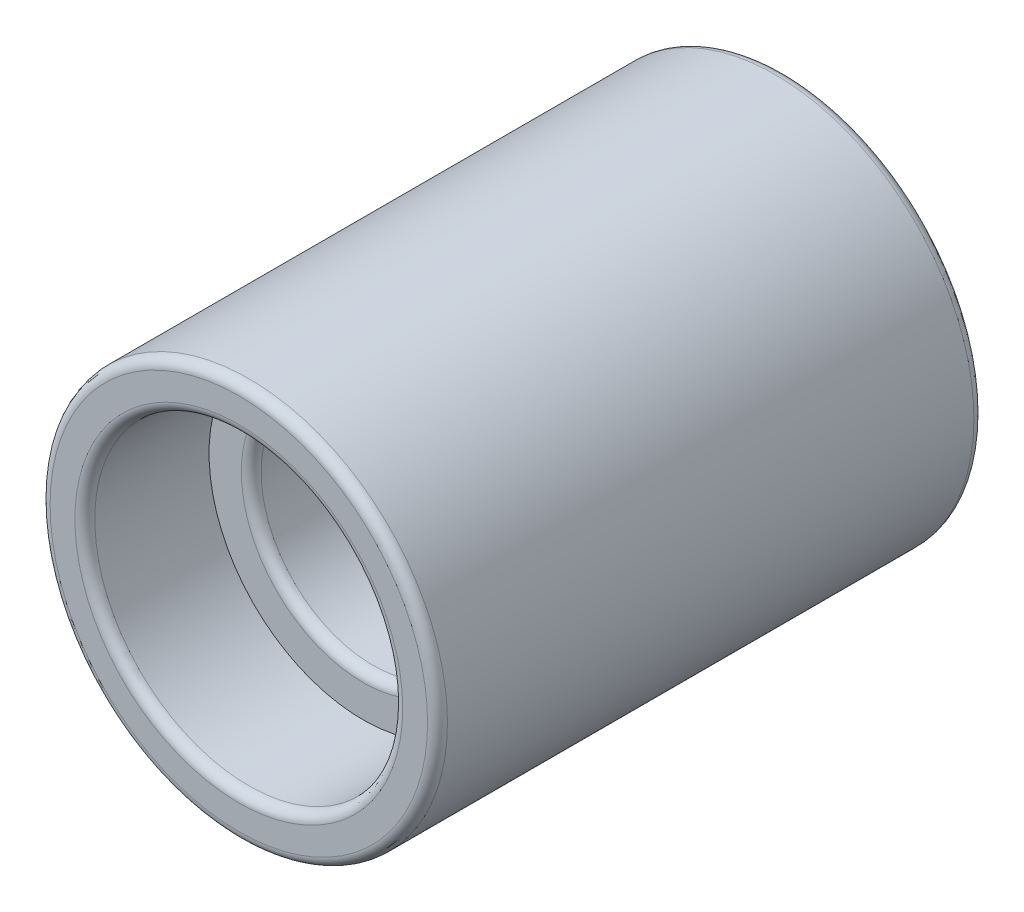
ISO-10303-21;
HEADER;
FILE_DESCRIPTION(('STEP AP214'),'2;1');
FILE_NAME('part.step','',(''),(''),'','','');
FILE_SCHEMA(('AUTOMOTIVE_DESIGN { 1 0 10303 214 1 1 1 1 }'));
ENDSEC;
DATA;
#1=APPLICATION_CONTEXT('core data for automotive mechanical design processes');
#2=APPLICATION_PROTOCOL_DEFINITION('international standard','automotive_design',2000,#1);
#3=PRODUCT_CONTEXT('',#1,'mechanical');
#4=PRODUCT('Part','Part','',(#3));
#5=PRODUCT_RELATED_PRODUCT_CATEGORY('part','',(#4));
#6=PRODUCT_DEFINITION_FORMATION('','',#4);
#7=PRODUCT_DEFINITION_CONTEXT('part definition',#1,'design');
#8=PRODUCT_DEFINITION('design','',#6,#7);
#9=PRODUCT_DEFINITION_SHAPE('','',#8);
#10=(LENGTH_UNIT() NAMED_UNIT(*) SI_UNIT(.MILLI.,.METRE.));
#11=(NAMED_UNIT(*) PLANE_ANGLE_UNIT() SI_UNIT($,.RADIAN.));
#12=(NAMED_UNIT(*) SI_UNIT($,.STERADIAN.) SOLID_ANGLE_UNIT());
#13=UNCERTAINTY_MEASURE_WITH_UNIT(LENGTH_MEASURE(1.E-05),#10,'distance_accuracy_value','');
#14=(GEOMETRIC_REPRESENTATION_CONTEXT(3) GLOBAL_UNCERTAINTY_ASSIGNED_CONTEXT((#13)) GLOBAL_UNIT_ASSIGNED_CONTEXT((#10,
#11,#12)) REPRESENTATION_CONTEXT('',''));
#15=CARTESIAN_POINT('',(0.,0.,0.));
#16=DIRECTION('',(0.,0.,1.));
#17=DIRECTION('',(1.,0.,0.));
#18=AXIS2_PLACEMENT_3D('',#15,#16,#17);
#19=CARTESIAN_POINT('',(17.0566896246943,83.,-11.25));
#20=DIRECTION('',(0.,0.,1.));
#21=DIRECTION('',(1.,0.,0.));
#22=AXIS2_PLACEMENT_3D('',#19,#20,#21);
#23=CYLINDRICAL_SURFACE('',#22,2.25);
#24=CARTESIAN_POINT('',(17.0566896246943,83.,-8.55));
#25=DIRECTION('',(0.,0.,-1.));
#26=DIRECTION('',(-1.,0.,0.));
#27=AXIS2_PLACEMENT_3D('',#24,#25,#26);
#28=CIRCLE('',#27,2.25);
#29=CARTESIAN_POINT('',(14.8066896246943,83.,-8.55));
#30=VERTEX_POINT('',#29);
#31=EDGE_CURVE('E68',#30,#30,#28,.T.);
#32=ORIENTED_EDGE('',*,*,#31,.T.);
#33=EDGE_LOOP('',(#32));
#34=FACE_BOUND('',#33,.T.);
#35=CARTESIAN_POINT('',(17.0566896246943,83.,-2.95));
#36=DIRECTION('',(0.,0.,1.));
#37=DIRECTION('',(1.,0.,0.));
#38=AXIS2_PLACEMENT_3D('',#35,#36,#37);
#39=CIRCLE('',#38,2.25);
#40=CARTESIAN_POINT('',(19.3066896246943,83.,-2.95));
#41=VERTEX_POINT('',#40);
#42=EDGE_CURVE('E71',#41,#41,#39,.T.);
#43=ORIENTED_EDGE('',*,*,#42,.T.);
#44=EDGE_LOOP('',(#43));
#45=FACE_BOUND('',#44,.T.);
#46=ADVANCED_FACE('F33',(#34,#45),#23,.F.);
#47=CARTESIAN_POINT('',(17.0566896246943,83.,-11.5));
#48=DIRECTION('',(0.,0.,1.));
#49=DIRECTION('',(1.,0.,0.));
#50=AXIS2_PLACEMENT_3D('',#47,#48,#49);
#51=CYLINDRICAL_SURFACE('',#50,4.);
#52=CARTESIAN_POINT('',(17.0566896246943,83.,-11.05));
#53=DIRECTION('',(0.,0.,-1.));
#54=DIRECTION('',(-1.,0.,0.));
#55=AXIS2_PLACEMENT_3D('',#52,#53,#54);
#56=CIRCLE('',#55,4.);
#57=CARTESIAN_POINT('',(21.0566896246943,83.,-11.05));
#58=VERTEX_POINT('',#57);
#59=EDGE_CURVE('E53',#58,#58,#56,.F.);
#60=CARTESIAN_POINT('',(17.0566896246943,83.,-0.450000000000001));
#61=DIRECTION('',(0.,0.,1.));
#62=DIRECTION('',(1.,0.,0.));
#63=AXIS2_PLACEMENT_3D('',#60,#61,#62);
#64=CIRCLE('',#63,4.);
#65=CARTESIAN_POINT('',(21.0566896246943,83.,-0.450000000000003));
#66=VERTEX_POINT('',#65);
#67=EDGE_CURVE('E56',#66,#66,#64,.F.);
#68=CARTESIAN_POINT('',(21.0566896246943,83.,-11.05));
#69=CARTESIAN_POINT('',(21.0566896246943,83.,-10.9395833333333));
#70=CARTESIAN_POINT('',(21.0566896246943,83.,-10.8291666666667));
#71=CARTESIAN_POINT('',(21.0566896246943,83.,-10.6083333333333));
#72=CARTESIAN_POINT('',(21.0566896246943,83.,-10.4979166666667));
#73=CARTESIAN_POINT('',(21.0566896246943,83.,-10.2770833333333));
#74=CARTESIAN_POINT('',(21.0566896246943,83.,-10.1666666666667));
#75=CARTESIAN_POINT('',(21.0566896246943,83.,-9.94583333333333));
#76=CARTESIAN_POINT('',(21.0566896246943,83.,-9.83541666666667));
#77=CARTESIAN_POINT('',(21.0566896246943,83.,-9.61458333333333));
#78=CARTESIAN_POINT('',(21.0566896246943,83.,-9.50416666666667));
#79=CARTESIAN_POINT('',(21.0566896246943,83.,-9.28333333333333));
#80=CARTESIAN_POINT('',(21.0566896246943,83.,-9.17291666666667));
#81=CARTESIAN_POINT('',(21.0566896246943,83.,-8.95208333333333));
#82=CARTESIAN_POINT('',(21.0566896246943,83.,-8.84166666666667));
#83=CARTESIAN_POINT('',(21.0566896246943,83.,-8.62083333333334));
#84=CARTESIAN_POINT('',(21.0566896246943,83.,-8.51041666666667));
#85=CARTESIAN_POINT('',(21.0566896246943,83.,-8.28958333333333));
#86=CARTESIAN_POINT('',(21.0566896246943,83.,-8.17916666666667));
#87=CARTESIAN_POINT('',(21.0566896246943,83.,-7.95833333333333));
#88=CARTESIAN_POINT('',(21.0566896246943,83.,-7.84791666666667));
#89=CARTESIAN_POINT('',(21.0566896246943,83.,-7.62708333333333));
#90=CARTESIAN_POINT('',(21.0566896246943,83.,-7.51666666666667));
#91=CARTESIAN_POINT('',(21.0566896246943,83.,-7.29583333333333));
#92=CARTESIAN_POINT('',(21.0566896246943,83.,-7.18541666666667));
#93=CARTESIAN_POINT('',(21.0566896246943,83.,-6.96458333333333));
#94=CARTESIAN_POINT('',(21.0566896246943,83.,-6.85416666666667));
#95=CARTESIAN_POINT('',(21.0566896246943,83.,-6.63333333333333));
#96=CARTESIAN_POINT('',(21.0566896246943,83.,-6.52291666666667));
#97=CARTESIAN_POINT('',(21.0566896246943,83.,-6.30208333333333));
#98=CARTESIAN_POINT('',(21.0566896246943,83.,-6.19166666666667));
#99=CARTESIAN_POINT('',(21.0566896246943,83.,-5.97083333333333));
#100=CARTESIAN_POINT('',(21.0566896246943,83.,-5.86041666666667));
#101=CARTESIAN_POINT('',(21.0566896246943,83.,-5.63958333333334));
#102=CARTESIAN_POINT('',(21.0566896246943,83.,-5.52916666666667));
#103=CARTESIAN_POINT('',(21.0566896246943,83.,-5.30833333333334));
#104=CARTESIAN_POINT('',(21.0566896246943,83.,-5.19791666666667));
#105=CARTESIAN_POINT('',(21.0566896246943,83.,-4.97708333333334));
#106=CARTESIAN_POINT('',(21.0566896246943,83.,-4.86666666666667));
#107=CARTESIAN_POINT('',(21.0566896246943,83.,-4.64583333333333));
#108=CARTESIAN_POINT('',(21.0566896246943,83.,-4.53541666666667));
#109=CARTESIAN_POINT('',(21.0566896246943,83.,-4.31458333333333));
#110=CARTESIAN_POINT('',(21.0566896246943,83.,-4.20416666666667));
#111=CARTESIAN_POINT('',(21.0566896246943,83.,-3.98333333333334));
#112=CARTESIAN_POINT('',(21.0566896246943,83.,-3.87291666666667));
#113=CARTESIAN_POINT('',(21.0566896246943,83.,-3.65208333333334));
#114=CARTESIAN_POINT('',(21.0566896246943,83.,-3.54166666666667));
#115=CARTESIAN_POINT('',(21.0566896246943,83.,-3.32083333333334));
#116=CARTESIAN_POINT('',(21.0566896246943,83.,-3.21041666666667));
#117=CARTESIAN_POINT('',(21.0566896246943,83.,-2.98958333333334));
#118=CARTESIAN_POINT('',(21.0566896246943,83.,-2.87916666666667));
#119=CARTESIAN_POINT('',(21.0566896246943,83.,-2.65833333333334));
#120=CARTESIAN_POINT('',(21.0566896246943,83.,-2.54791666666667));
#121=CARTESIAN_POINT('',(21.0566896246943,83.,-2.32708333333334));
#122=CARTESIAN_POINT('',(21.0566896246943,83.,-2.21666666666667));
#123=CARTESIAN_POINT('',(21.0566896246943,83.,-1.99583333333334));
#124=CARTESIAN_POINT('',(21.0566896246943,83.,-1.88541666666667));
#125=CARTESIAN_POINT('',(21.0566896246943,83.,-1.66458333333334));
#126=CARTESIAN_POINT('',(21.0566896246943,83.,-1.55416666666667));
#127=CARTESIAN_POINT('',(21.0566896246943,83.,-1.33333333333334));
#128=CARTESIAN_POINT('',(21.0566896246943,83.,-1.22291666666667));
#129=CARTESIAN_POINT('',(21.0566896246943,83.,-1.00208333333334));
#130=CARTESIAN_POINT('',(21.0566896246943,83.,-0.891666666666669));
#131=CARTESIAN_POINT('',(21.0566896246943,83.,-0.670833333333336));
#132=CARTESIAN_POINT('',(21.0566896246943,83.,-0.560416666666669));
#133=CARTESIAN_POINT('',(21.0566896246943,83.,-0.450000000000003));
#134=B_SPLINE_CURVE_WITH_KNOTS('',3,(#68,#69,#70,#71,#72,#73,#74,#75,#76,#77,#78,#79,#80,#81,
#82,#83,#84,#85,#86,#87,#88,#89,#90,#91,#92,#93,#94,#95,#96,#97,#98,#99,#100,#101,#102,#103,
#104,#105,#106,#107,#108,#109,#110,#111,#112,#113,#114,#115,#116,#117,#118,#119,#120,#121,#122,
#123,#124,#125,#126,#127,#128,#129,#130,#131,#132,#133),.UNSPECIFIED.,.F.,.F.,(4,2,2,2,2,2,2,2,
2,2,2,2,2,2,2,2,2,2,2,2,2,2,2,2,2,2,2,2,2,2,2,2,4),(0.,0.33125,0.662499999999998,
0.993749999999998,1.325,1.65625,1.9875,2.31875,2.65,2.98125,3.3125,3.64375,3.975,4.30625,4.6375,
4.96875,5.3,5.63125,5.9625,6.29375,6.625,6.95625,7.2875,7.61875,7.95,8.28125,8.6125,8.94375,
9.275,9.60625,9.9375,10.26875,10.6),.UNSPECIFIED.);
#135=EDGE_CURVE('BSEAM102',#58,#66,#134,.T.);
#136=ORIENTED_EDGE('',*,*,#59,.T.);
#137=ORIENTED_EDGE('',*,*,#67,.T.);
#138=ORIENTED_EDGE('',*,*,#135,.T.);
#139=ORIENTED_EDGE('',*,*,#135,.F.);
#140=EDGE_LOOP('',(#136,#138,#137,#139));
#141=FACE_BOUND('',#140,.T.);
#142=ADVANCED_FACE('F102',(#141),#51,.T.);
#143=CARTESIAN_POINT('',(0.,0.,-0.25));
#144=DIRECTION('',(0.,0.,1.));
#145=DIRECTION('',(1.,0.,0.));
#146=AXIS2_PLACEMENT_3D('',#143,#144,#145);
#147=PLANE('',#146);
#148=CARTESIAN_POINT('',(17.0566896246943,83.,-0.25));
#149=DIRECTION('',(0.,0.,1.));
#150=DIRECTION('',(1.,0.,0.));
#151=AXIS2_PLACEMENT_3D('',#148,#149,#150);
#152=CIRCLE('',#151,3.30000000000001);
#153=CARTESIAN_POINT('',(20.3566896246943,83.,-0.25));
#154=VERTEX_POINT('',#153);
#155=EDGE_CURVE('E10',#154,#154,#152,.F.);
#156=ORIENTED_EDGE('',*,*,#155,.T.);
#157=EDGE_LOOP('',(#156));
#158=FACE_BOUND('',#157,.T.);
#159=CARTESIAN_POINT('',(17.0566896246943,83.,-0.25));
#160=DIRECTION('',(0.,0.,1.));
#161=DIRECTION('',(1.,0.,0.));
#162=AXIS2_PLACEMENT_3D('',#159,#160,#161);
#163=CIRCLE('',#162,3.8);
#164=CARTESIAN_POINT('',(20.8566896246943,83.,-0.25));
#165=VERTEX_POINT('',#164);
#166=EDGE_CURVE('E40',#165,#165,#163,.T.);
#167=ORIENTED_EDGE('',*,*,#166,.T.);
#168=EDGE_LOOP('',(#167));
#169=FACE_BOUND('',#168,.T.);
#170=ADVANCED_FACE('F108',(#158,#169),#147,.T.);
#171=CARTESIAN_POINT('',(17.0566896246943,83.,-11.25));
#172=DIRECTION('',(0.,0.,-1.));
#173=DIRECTION('',(-1.,0.,0.));
#174=AXIS2_PLACEMENT_3D('',#171,#172,#173);
#175=PLANE('',#174);
#176=CARTESIAN_POINT('',(17.0566896246943,83.,-11.25));
#177=DIRECTION('',(0.,0.,-1.));
#178=DIRECTION('',(-1.,0.,0.));
#179=AXIS2_PLACEMENT_3D('',#176,#177,#178);
#180=CIRCLE('',#179,3.30000000000001);
#181=CARTESIAN_POINT('',(13.7566896246943,83.,-11.25));
#182=VERTEX_POINT('',#181);
#183=EDGE_CURVE('E62',#182,#182,#180,.F.);
#184=ORIENTED_EDGE('',*,*,#183,.T.);
#185=EDGE_LOOP('',(#184));
#186=FACE_BOUND('',#185,.T.);
#187=CARTESIAN_POINT('',(17.0566896246943,83.,-11.25));
#188=DIRECTION('',(0.,0.,-1.));
#189=DIRECTION('',(-1.,0.,0.));
#190=AXIS2_PLACEMENT_3D('',#187,#188,#189);
#191=CIRCLE('',#190,3.8);
#192=CARTESIAN_POINT('',(13.2566896246943,83.,-11.25));
#193=VERTEX_POINT('',#192);
#194=EDGE_CURVE('E65',#193,#193,#191,.T.);
#195=ORIENTED_EDGE('',*,*,#194,.T.);
#196=EDGE_LOOP('',(#195));
#197=FACE_BOUND('',#196,.T.);
#198=ADVANCED_FACE('F115',(#186,#197),#175,.T.);
#199=CARTESIAN_POINT('',(17.0566896246943,83.,-2.75));
#200=DIRECTION('',(0.,0.,1.));
#201=DIRECTION('',(1.,0.,0.));
#202=AXIS2_PLACEMENT_3D('',#199,#200,#201);
#203=CYLINDRICAL_SURFACE('',#202,3.10000000000001);
#204=CARTESIAN_POINT('',(17.0566896246943,83.,-0.45));
#205=DIRECTION('',(0.,0.,1.));
#206=DIRECTION('',(1.,0.,0.));
#207=AXIS2_PLACEMENT_3D('',#204,#205,#206);
#208=CIRCLE('',#207,3.10000000000001);
#209=CARTESIAN_POINT('',(20.1566896246943,83.,-0.45));
#210=VERTEX_POINT('',#209);
#211=EDGE_CURVE('E44',#210,#210,#208,.T.);
#212=ORIENTED_EDGE('',*,*,#211,.T.);
#213=EDGE_LOOP('',(#212));
#214=FACE_BOUND('',#213,.T.);
#215=CARTESIAN_POINT('',(17.0566896246943,83.,-2.75));
#216=DIRECTION('',(0.,0.,1.));
#217=DIRECTION('',(1.,0.,0.));
#218=AXIS2_PLACEMENT_3D('',#215,#216,#217);
#219=CIRCLE('',#218,3.10000000000001);
#220=CARTESIAN_POINT('',(20.1566896246943,83.,-2.75));
#221=VERTEX_POINT('',#220);
#222=EDGE_CURVE('E77',#221,#221,#219,.T.);
#223=ORIENTED_EDGE('',*,*,#222,.F.);
#224=EDGE_LOOP('',(#223));
#225=FACE_BOUND('',#224,.T.);
#226=ADVANCED_FACE('F98',(#214,#225),#203,.F.);
#227=CARTESIAN_POINT('',(0.,0.,-2.75));
#228=DIRECTION('',(0.,0.,1.));
#229=DIRECTION('',(1.,0.,0.));
#230=AXIS2_PLACEMENT_3D('',#227,#228,#229);
#231=PLANE('',#230);
#232=CARTESIAN_POINT('',(17.0566896246943,83.,-2.75));
#233=DIRECTION('',(0.,0.,1.));
#234=DIRECTION('',(1.,0.,0.));
#235=AXIS2_PLACEMENT_3D('',#232,#233,#234);
#236=CIRCLE('',#235,2.45);
#237=CARTESIAN_POINT('',(19.5066896246943,83.,-2.75));
#238=VERTEX_POINT('',#237);
#239=EDGE_CURVE('E48',#238,#238,#236,.F.);
#240=ORIENTED_EDGE('',*,*,#239,.T.);
#241=EDGE_LOOP('',(#240));
#242=FACE_BOUND('',#241,.T.);
#243=ORIENTED_EDGE('',*,*,#222,.T.);
#244=EDGE_LOOP('',(#243));
#245=FACE_BOUND('',#244,.T.);
#246=ADVANCED_FACE('F88',(#242,#245),#231,.T.);
#247=CARTESIAN_POINT('',(0.,0.,-8.75));
#248=DIRECTION('',(0.,0.,-1.));
#249=DIRECTION('',(1.,0.,0.));
#250=AXIS2_PLACEMENT_3D('',#247,#248,#249);
#251=PLANE('',#250);
#252=CARTESIAN_POINT('',(17.0566896246943,83.,-8.75));
#253=DIRECTION('',(0.,0.,-1.));
#254=DIRECTION('',(-1.,0.,0.));
#255=AXIS2_PLACEMENT_3D('',#252,#253,#254);
#256=CIRCLE('',#255,2.45);
#257=CARTESIAN_POINT('',(14.6066896246943,83.,-8.75));
#258=VERTEX_POINT('',#257);
#259=EDGE_CURVE('E74',#258,#258,#256,.F.);
#260=ORIENTED_EDGE('',*,*,#259,.T.);
#261=EDGE_LOOP('',(#260));
#262=FACE_BOUND('',#261,.T.);
#263=CARTESIAN_POINT('',(17.0566896246943,83.,-8.75));
#264=DIRECTION('',(0.,0.,1.));
#265=DIRECTION('',(1.,0.,0.));
#266=AXIS2_PLACEMENT_3D('',#263,#264,#265);
#267=CIRCLE('',#266,3.10000000000001);
#268=CARTESIAN_POINT('',(20.1566896246943,83.,-8.75));
#269=VERTEX_POINT('',#268);
#270=EDGE_CURVE('E80',#269,#269,#267,.T.);
#271=ORIENTED_EDGE('',*,*,#270,.F.);
#272=EDGE_LOOP('',(#271));
#273=FACE_BOUND('',#272,.T.);
#274=ADVANCED_FACE('F86',(#262,#273),#251,.T.);
#275=CARTESIAN_POINT('',(17.0566896246943,83.,-8.75));
#276=DIRECTION('',(0.,0.,-1.));
#277=DIRECTION('',(-1.,0.,0.));
#278=AXIS2_PLACEMENT_3D('',#275,#276,#277);
#279=CYLINDRICAL_SURFACE('',#278,3.10000000000001);
#280=CARTESIAN_POINT('',(17.0566896246943,83.,-11.05));
#281=DIRECTION('',(0.,0.,-1.));
#282=DIRECTION('',(-1.,0.,0.));
#283=AXIS2_PLACEMENT_3D('',#280,#281,#282);
#284=CIRCLE('',#283,3.10000000000001);
#285=CARTESIAN_POINT('',(13.9566896246943,83.,-11.05));
#286=VERTEX_POINT('',#285);
#287=EDGE_CURVE('E59',#286,#286,#284,.T.);
#288=ORIENTED_EDGE('',*,*,#287,.T.);
#289=EDGE_LOOP('',(#288));
#290=FACE_BOUND('',#289,.T.);
#291=ORIENTED_EDGE('',*,*,#270,.T.);
#292=EDGE_LOOP('',(#291));
#293=FACE_BOUND('',#292,.T.);
#294=ADVANCED_FACE('F84',(#290,#293),#279,.F.);
#295=CARTESIAN_POINT('',(17.0566896246943,83.,-8.55));
#296=DIRECTION('',(0.,0.,-1.));
#297=DIRECTION('',(-1.,0.,0.));
#298=AXIS2_PLACEMENT_3D('',#295,#296,#297);
#299=TOROIDAL_SURFACE('',#298,2.45,0.2);
#300=ORIENTED_EDGE('',*,*,#31,.F.);
#301=EDGE_LOOP('',(#300));
#302=FACE_BOUND('',#301,.T.);
#303=ORIENTED_EDGE('',*,*,#259,.F.);
#304=EDGE_LOOP('',(#303));
#305=FACE_BOUND('',#304,.T.);
#306=ADVANCED_FACE('F95',(#302,#305),#299,.T.);
#307=CARTESIAN_POINT('',(17.0566896246943,83.,-11.05));
#308=DIRECTION('',(0.,0.,-1.));
#309=DIRECTION('',(-1.,0.,0.));
#310=AXIS2_PLACEMENT_3D('',#307,#308,#309);
#311=TOROIDAL_SURFACE('',#310,3.30000000000001,0.2);
#312=ORIENTED_EDGE('',*,*,#287,.F.);
#313=EDGE_LOOP('',(#312));
#314=FACE_BOUND('',#313,.T.);
#315=ORIENTED_EDGE('',*,*,#183,.F.);
#316=EDGE_LOOP('',(#315));
#317=FACE_BOUND('',#316,.T.);
#318=ADVANCED_FACE('F124',(#314,#317),#311,.T.);
#319=CARTESIAN_POINT('',(17.0566896246943,83.,-11.05));
#320=DIRECTION('',(0.,0.,-1.));
#321=DIRECTION('',(-1.,0.,0.));
#322=AXIS2_PLACEMENT_3D('',#319,#320,#321);
#323=TOROIDAL_SURFACE('',#322,3.8,0.2);
#324=ORIENTED_EDGE('',*,*,#59,.F.);
#325=EDGE_LOOP('',(#324));
#326=FACE_BOUND('',#325,.T.);
#327=ORIENTED_EDGE('',*,*,#194,.F.);
#328=EDGE_LOOP('',(#327));
#329=FACE_BOUND('',#328,.T.);
#330=ADVANCED_FACE('F128',(#326,#329),#323,.T.);
#331=CARTESIAN_POINT('',(17.0566896246943,83.,-2.95));
#332=DIRECTION('',(0.,0.,1.));
#333=DIRECTION('',(1.,0.,0.));
#334=AXIS2_PLACEMENT_3D('',#331,#332,#333);
#335=TOROIDAL_SURFACE('',#334,2.45,0.2);
#336=ORIENTED_EDGE('',*,*,#239,.F.);
#337=EDGE_LOOP('',(#336));
#338=FACE_BOUND('',#337,.T.);
#339=ORIENTED_EDGE('',*,*,#42,.F.);
#340=EDGE_LOOP('',(#339));
#341=FACE_BOUND('',#340,.T.);
#342=ADVANCED_FACE('F132',(#338,#341),#335,.T.);
#343=CARTESIAN_POINT('',(17.0566896246943,83.,-0.45));
#344=DIRECTION('',(0.,0.,1.));
#345=DIRECTION('',(1.,0.,0.));
#346=AXIS2_PLACEMENT_3D('',#343,#344,#345);
#347=TOROIDAL_SURFACE('',#346,3.30000000000001,0.2);
#348=ORIENTED_EDGE('',*,*,#155,.F.);
#349=EDGE_LOOP('',(#348));
#350=FACE_BOUND('',#349,.T.);
#351=ORIENTED_EDGE('',*,*,#211,.F.);
#352=EDGE_LOOP('',(#351));
#353=FACE_BOUND('',#352,.T.);
#354=ADVANCED_FACE('F135',(#350,#353),#347,.T.);
#355=CARTESIAN_POINT('',(17.0566896246943,83.,-0.450000000000001));
#356=DIRECTION('',(0.,0.,1.));
#357=DIRECTION('',(1.,0.,0.));
#358=AXIS2_PLACEMENT_3D('',#355,#356,#357);
#359=TOROIDAL_SURFACE('',#358,3.8,0.2);
#360=ORIENTED_EDGE('',*,*,#67,.F.);
#361=EDGE_LOOP('',(#360));
#362=FACE_BOUND('',#361,.T.);
#363=ORIENTED_EDGE('',*,*,#166,.F.);
#364=EDGE_LOOP('',(#363));
#365=FACE_BOUND('',#364,.T.);
#366=ADVANCED_FACE('F35',(#362,#365),#359,.T.);
#367=CLOSED_SHELL('',(#46,#142,#170,#198,#226,#246,#274,#294,#306,#318,#330,#342,#354,#366));
#368=MANIFOLD_SOLID_BREP('B2',#367);
#369=ADVANCED_BREP_SHAPE_REPRESENTATION('',(#18,#368),#14);
#370=SHAPE_DEFINITION_REPRESENTATION(#9,#369);
ENDSEC;
END-ISO-10303-21;
